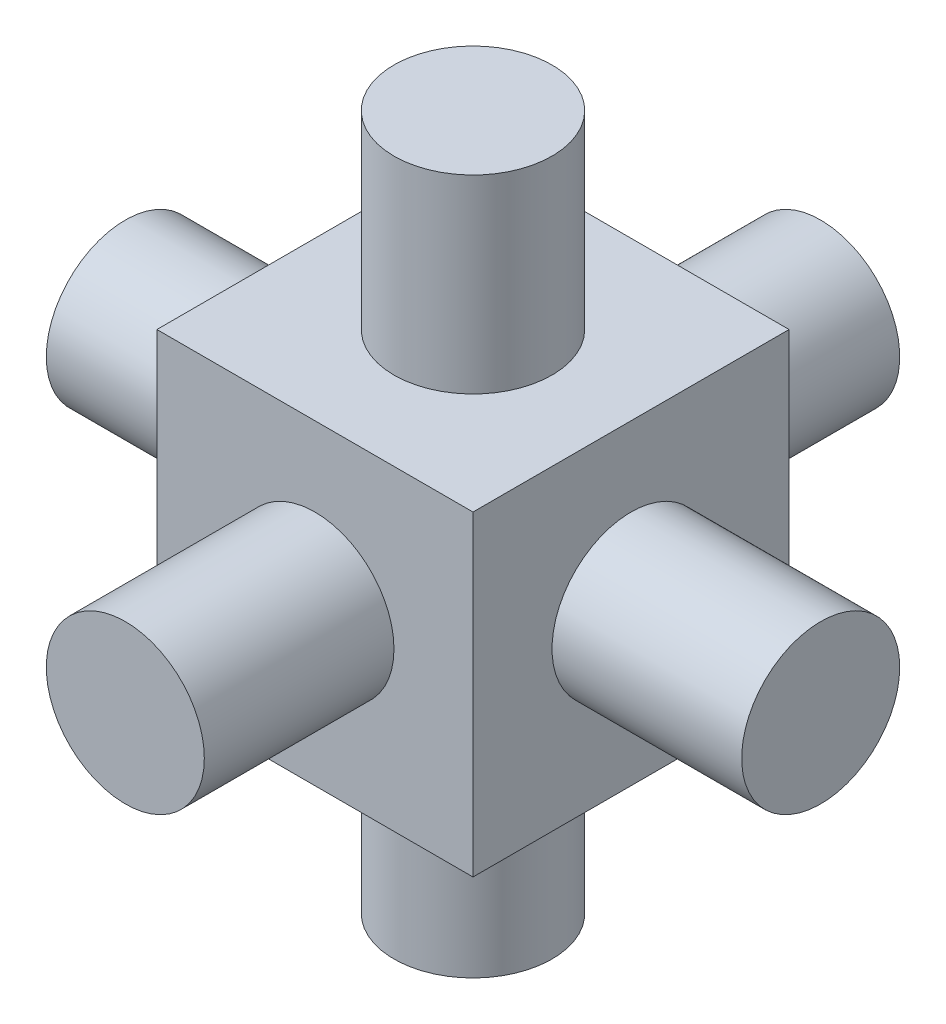
ISO-10303-21;
HEADER;
FILE_DESCRIPTION(('STEP AP214'),'2;1');
FILE_NAME('part.step','',(''),(''),'','','');
FILE_SCHEMA(('AUTOMOTIVE_DESIGN { 1 0 10303 214 1 1 1 1 }'));
ENDSEC;
DATA;
#1=APPLICATION_CONTEXT('core data for automotive mechanical design processes');
#2=APPLICATION_PROTOCOL_DEFINITION('international standard','automotive_design',2000,#1);
#3=PRODUCT_CONTEXT('',#1,'mechanical');
#4=PRODUCT('Part','Part','',(#3));
#5=PRODUCT_RELATED_PRODUCT_CATEGORY('part','',(#4));
#6=PRODUCT_DEFINITION_FORMATION('','',#4);
#7=PRODUCT_DEFINITION_CONTEXT('part definition',#1,'design');
#8=PRODUCT_DEFINITION('design','',#6,#7);
#9=PRODUCT_DEFINITION_SHAPE('','',#8);
#10=(LENGTH_UNIT() NAMED_UNIT(*) SI_UNIT(.MILLI.,.METRE.));
#11=(NAMED_UNIT(*) PLANE_ANGLE_UNIT() SI_UNIT($,.RADIAN.));
#12=(NAMED_UNIT(*) SI_UNIT($,.STERADIAN.) SOLID_ANGLE_UNIT());
#13=UNCERTAINTY_MEASURE_WITH_UNIT(LENGTH_MEASURE(1.E-05),#10,'distance_accuracy_value','');
#14=(GEOMETRIC_REPRESENTATION_CONTEXT(3) GLOBAL_UNCERTAINTY_ASSIGNED_CONTEXT((#13)) GLOBAL_UNIT_ASSIGNED_CONTEXT((#10,
#11,#12)) REPRESENTATION_CONTEXT('',''));
#15=CARTESIAN_POINT('',(0.,0.,0.));
#16=DIRECTION('',(0.,0.,1.));
#17=DIRECTION('',(1.,0.,0.));
#18=AXIS2_PLACEMENT_3D('',#15,#16,#17);
#19=CARTESIAN_POINT('',(10.,-10.,20.));
#20=DIRECTION('',(-1.,0.,0.));
#21=DIRECTION('',(0.,0.,1.));
#22=AXIS2_PLACEMENT_3D('',#19,#20,#21);
#23=PLANE('',#22);
#24=CARTESIAN_POINT('',(10.,0.,10.));
#25=DIRECTION('',(1.,0.,0.));
#26=DIRECTION('',(0.,0.,-1.));
#27=AXIS2_PLACEMENT_3D('',#24,#25,#26);
#28=CIRCLE('',#27,5.);
#29=CARTESIAN_POINT('',(10.,0.,5.));
#30=VERTEX_POINT('',#29);
#31=EDGE_CURVE('E136',#30,#30,#28,.T.);
#32=ORIENTED_EDGE('',*,*,#31,.F.);
#33=EDGE_LOOP('',(#32));
#34=FACE_BOUND('',#33,.T.);
#35=DIRECTION('',(0.,1.,0.));
#36=VECTOR('',#35,1.);
#37=CARTESIAN_POINT('',(10.,-10.,0.));
#38=LINE('',#37,#36);
#39=CARTESIAN_POINT('',(10.,-10.,0.));
#40=VERTEX_POINT('',#39);
#41=CARTESIAN_POINT('',(10.,10.,0.));
#42=VERTEX_POINT('',#41);
#43=EDGE_CURVE('E115',#40,#42,#38,.T.);
#44=ORIENTED_EDGE('',*,*,#43,.T.);
#45=DIRECTION('',(0.,0.,-1.));
#46=VECTOR('',#45,1.);
#47=CARTESIAN_POINT('',(10.,10.,20.));
#48=LINE('',#47,#46);
#49=CARTESIAN_POINT('',(10.,10.,20.));
#50=VERTEX_POINT('',#49);
#51=EDGE_CURVE('E46',#50,#42,#48,.T.);
#52=ORIENTED_EDGE('',*,*,#51,.F.);
#53=DIRECTION('',(0.,1.,0.));
#54=VECTOR('',#53,1.);
#55=CARTESIAN_POINT('',(10.,-10.,20.));
#56=LINE('',#55,#54);
#57=CARTESIAN_POINT('',(10.,-10.,20.));
#58=VERTEX_POINT('',#57);
#59=EDGE_CURVE('E98',#58,#50,#56,.T.);
#60=ORIENTED_EDGE('',*,*,#59,.F.);
#61=DIRECTION('',(0.,0.,-1.));
#62=VECTOR('',#61,1.);
#63=CARTESIAN_POINT('',(10.,-10.,20.));
#64=LINE('',#63,#62);
#65=EDGE_CURVE('E111',#58,#40,#64,.T.);
#66=ORIENTED_EDGE('',*,*,#65,.T.);
#67=EDGE_LOOP('',(#44,#52,#60,#66));
#68=FACE_BOUND('',#67,.T.);
#69=ADVANCED_FACE('F43',(#34,#68),#23,.F.);
#70=CARTESIAN_POINT('',(-10.,10.,20.));
#71=DIRECTION('',(0.,-1.,0.));
#72=DIRECTION('',(0.,0.,-1.));
#73=AXIS2_PLACEMENT_3D('',#70,#71,#72);
#74=PLANE('',#73);
#75=CARTESIAN_POINT('',(0.,10.,10.));
#76=DIRECTION('',(0.,1.,0.));
#77=DIRECTION('',(0.,0.,1.));
#78=AXIS2_PLACEMENT_3D('',#75,#76,#77);
#79=CIRCLE('',#78,5.);
#80=CARTESIAN_POINT('',(0.,10.,15.));
#81=VERTEX_POINT('',#80);
#82=EDGE_CURVE('E140',#81,#81,#79,.T.);
#83=ORIENTED_EDGE('',*,*,#82,.F.);
#84=EDGE_LOOP('',(#83));
#85=FACE_BOUND('',#84,.T.);
#86=DIRECTION('',(-1.,0.,0.));
#87=VECTOR('',#86,1.);
#88=CARTESIAN_POINT('',(-10.,10.,0.));
#89=LINE('',#88,#87);
#90=CARTESIAN_POINT('',(-10.,10.,0.));
#91=VERTEX_POINT('',#90);
#92=EDGE_CURVE('E104',#42,#91,#89,.T.);
#93=ORIENTED_EDGE('',*,*,#92,.T.);
#94=DIRECTION('',(0.,0.,-1.));
#95=VECTOR('',#94,1.);
#96=CARTESIAN_POINT('',(-10.,10.,20.));
#97=LINE('',#96,#95);
#98=CARTESIAN_POINT('',(-10.,10.,20.));
#99=VERTEX_POINT('',#98);
#100=EDGE_CURVE('E102',#99,#91,#97,.T.);
#101=ORIENTED_EDGE('',*,*,#100,.F.);
#102=DIRECTION('',(-1.,0.,0.));
#103=VECTOR('',#102,1.);
#104=CARTESIAN_POINT('',(-10.,10.,20.));
#105=LINE('',#104,#103);
#106=EDGE_CURVE('E93',#50,#99,#105,.T.);
#107=ORIENTED_EDGE('',*,*,#106,.F.);
#108=ORIENTED_EDGE('',*,*,#51,.T.);
#109=EDGE_LOOP('',(#93,#101,#107,#108));
#110=FACE_BOUND('',#109,.T.);
#111=ADVANCED_FACE('F103',(#85,#110),#74,.F.);
#112=CARTESIAN_POINT('',(-10.,-10.,20.));
#113=DIRECTION('',(1.,0.,0.));
#114=DIRECTION('',(0.,0.,-1.));
#115=AXIS2_PLACEMENT_3D('',#112,#113,#114);
#116=PLANE('',#115);
#117=CARTESIAN_POINT('',(-10.,0.,10.));
#118=DIRECTION('',(-1.,0.,0.));
#119=DIRECTION('',(0.,0.,1.));
#120=AXIS2_PLACEMENT_3D('',#117,#118,#119);
#121=CIRCLE('',#120,5.);
#122=CARTESIAN_POINT('',(-10.,0.,15.));
#123=VERTEX_POINT('',#122);
#124=EDGE_CURVE('E148',#123,#123,#121,.T.);
#125=ORIENTED_EDGE('',*,*,#124,.F.);
#126=EDGE_LOOP('',(#125));
#127=FACE_BOUND('',#126,.T.);
#128=DIRECTION('',(0.,-1.,0.));
#129=VECTOR('',#128,1.);
#130=CARTESIAN_POINT('',(-10.,-10.,0.));
#131=LINE('',#130,#129);
#132=CARTESIAN_POINT('',(-10.,-10.,0.));
#133=VERTEX_POINT('',#132);
#134=EDGE_CURVE('E79',#91,#133,#131,.T.);
#135=ORIENTED_EDGE('',*,*,#134,.T.);
#136=DIRECTION('',(0.,0.,-1.));
#137=VECTOR('',#136,1.);
#138=CARTESIAN_POINT('',(-10.,-10.,20.));
#139=LINE('',#138,#137);
#140=CARTESIAN_POINT('',(-10.,-10.,20.));
#141=VERTEX_POINT('',#140);
#142=EDGE_CURVE('E106',#141,#133,#139,.T.);
#143=ORIENTED_EDGE('',*,*,#142,.F.);
#144=DIRECTION('',(0.,-1.,0.));
#145=VECTOR('',#144,1.);
#146=CARTESIAN_POINT('',(-10.,-10.,20.));
#147=LINE('',#146,#145);
#148=EDGE_CURVE('E96',#99,#141,#147,.T.);
#149=ORIENTED_EDGE('',*,*,#148,.F.);
#150=ORIENTED_EDGE('',*,*,#100,.T.);
#151=EDGE_LOOP('',(#135,#143,#149,#150));
#152=FACE_BOUND('',#151,.T.);
#153=ADVANCED_FACE('F107',(#127,#152),#116,.F.);
#154=CARTESIAN_POINT('',(-10.,-10.,20.));
#155=DIRECTION('',(0.,1.,0.));
#156=DIRECTION('',(0.,0.,1.));
#157=AXIS2_PLACEMENT_3D('',#154,#155,#156);
#158=PLANE('',#157);
#159=CARTESIAN_POINT('',(0.,-10.,10.));
#160=DIRECTION('',(0.,-1.,0.));
#161=DIRECTION('',(0.,0.,-1.));
#162=AXIS2_PLACEMENT_3D('',#159,#160,#161);
#163=CIRCLE('',#162,5.);
#164=CARTESIAN_POINT('',(0.,-10.,5.));
#165=VERTEX_POINT('',#164);
#166=EDGE_CURVE('E156',#165,#165,#163,.T.);
#167=ORIENTED_EDGE('',*,*,#166,.F.);
#168=EDGE_LOOP('',(#167));
#169=FACE_BOUND('',#168,.T.);
#170=DIRECTION('',(1.,0.,0.));
#171=VECTOR('',#170,1.);
#172=CARTESIAN_POINT('',(-10.,-10.,0.));
#173=LINE('',#172,#171);
#174=EDGE_CURVE('E85',#133,#40,#173,.T.);
#175=ORIENTED_EDGE('',*,*,#174,.T.);
#176=ORIENTED_EDGE('',*,*,#65,.F.);
#177=DIRECTION('',(1.,0.,0.));
#178=VECTOR('',#177,1.);
#179=CARTESIAN_POINT('',(-10.,-10.,20.));
#180=LINE('',#179,#178);
#181=EDGE_CURVE('E62',#141,#58,#180,.T.);
#182=ORIENTED_EDGE('',*,*,#181,.F.);
#183=ORIENTED_EDGE('',*,*,#142,.T.);
#184=EDGE_LOOP('',(#175,#176,#182,#183));
#185=FACE_BOUND('',#184,.T.);
#186=ADVANCED_FACE('F129',(#169,#185),#158,.F.);
#187=CARTESIAN_POINT('',(0.,0.,20.));
#188=DIRECTION('',(0.,0.,-1.));
#189=DIRECTION('',(-1.,0.,0.));
#190=AXIS2_PLACEMENT_3D('',#187,#188,#189);
#191=PLANE('',#190);
#192=CARTESIAN_POINT('',(0.,0.,20.));
#193=DIRECTION('',(0.,0.,1.));
#194=DIRECTION('',(1.,0.,0.));
#195=AXIS2_PLACEMENT_3D('',#192,#193,#194);
#196=CIRCLE('',#195,5.);
#197=CARTESIAN_POINT('',(5.,0.,20.));
#198=VERTEX_POINT('',#197);
#199=EDGE_CURVE('E11',#198,#198,#196,.T.);
#200=ORIENTED_EDGE('',*,*,#199,.F.);
#201=EDGE_LOOP('',(#200));
#202=FACE_BOUND('',#201,.T.);
#203=ORIENTED_EDGE('',*,*,#59,.T.);
#204=ORIENTED_EDGE('',*,*,#106,.T.);
#205=ORIENTED_EDGE('',*,*,#148,.T.);
#206=ORIENTED_EDGE('',*,*,#181,.T.);
#207=EDGE_LOOP('',(#203,#204,#205,#206));
#208=FACE_BOUND('',#207,.T.);
#209=ADVANCED_FACE('F94',(#202,#208),#191,.F.);
#210=CARTESIAN_POINT('',(0.,0.,0.));
#211=DIRECTION('',(0.,0.,-1.));
#212=DIRECTION('',(-1.,0.,0.));
#213=AXIS2_PLACEMENT_3D('',#210,#211,#212);
#214=PLANE('',#213);
#215=CARTESIAN_POINT('',(0.,0.,0.));
#216=DIRECTION('',(0.,0.,-1.));
#217=DIRECTION('',(-1.,0.,0.));
#218=AXIS2_PLACEMENT_3D('',#215,#216,#217);
#219=CIRCLE('',#218,5.);
#220=CARTESIAN_POINT('',(-5.,0.,0.));
#221=VERTEX_POINT('',#220);
#222=EDGE_CURVE('E53',#221,#221,#219,.T.);
#223=ORIENTED_EDGE('',*,*,#222,.F.);
#224=EDGE_LOOP('',(#223));
#225=FACE_BOUND('',#224,.T.);
#226=ORIENTED_EDGE('',*,*,#43,.F.);
#227=ORIENTED_EDGE('',*,*,#174,.F.);
#228=ORIENTED_EDGE('',*,*,#134,.F.);
#229=ORIENTED_EDGE('',*,*,#92,.F.);
#230=EDGE_LOOP('',(#226,#227,#228,#229));
#231=FACE_BOUND('',#230,.T.);
#232=ADVANCED_FACE('F132',(#225,#231),#214,.T.);
#233=CARTESIAN_POINT('',(22.,0.,10.));
#234=DIRECTION('',(-1.,0.,0.));
#235=DIRECTION('',(0.,0.,1.));
#236=AXIS2_PLACEMENT_3D('',#233,#234,#235);
#237=CYLINDRICAL_SURFACE('',#236,5.);
#238=CARTESIAN_POINT('',(22.,0.,10.));
#239=DIRECTION('',(1.,0.,0.));
#240=DIRECTION('',(0.,0.,-1.));
#241=AXIS2_PLACEMENT_3D('',#238,#239,#240);
#242=CIRCLE('',#241,5.);
#243=CARTESIAN_POINT('',(22.,0.,5.));
#244=VERTEX_POINT('',#243);
#245=EDGE_CURVE('E119',#244,#244,#242,.T.);
#246=ORIENTED_EDGE('',*,*,#245,.F.);
#247=EDGE_LOOP('',(#246));
#248=FACE_BOUND('',#247,.T.);
#249=ORIENTED_EDGE('',*,*,#31,.T.);
#250=EDGE_LOOP('',(#249));
#251=FACE_BOUND('',#250,.T.);
#252=ADVANCED_FACE('F194',(#248,#251),#237,.T.);
#253=CARTESIAN_POINT('',(22.,0.,10.));
#254=DIRECTION('',(1.,0.,0.));
#255=DIRECTION('',(0.,0.,-1.));
#256=AXIS2_PLACEMENT_3D('',#253,#254,#255);
#257=PLANE('',#256);
#258=ORIENTED_EDGE('',*,*,#245,.T.);
#259=EDGE_LOOP('',(#258));
#260=FACE_BOUND('',#259,.T.);
#261=ADVANCED_FACE('F209',(#260),#257,.T.);
#262=CARTESIAN_POINT('',(0.,22.,10.));
#263=DIRECTION('',(0.,-1.,0.));
#264=DIRECTION('',(0.,0.,-1.));
#265=AXIS2_PLACEMENT_3D('',#262,#263,#264);
#266=CYLINDRICAL_SURFACE('',#265,5.);
#267=CARTESIAN_POINT('',(0.,22.,10.));
#268=DIRECTION('',(0.,1.,0.));
#269=DIRECTION('',(0.,0.,1.));
#270=AXIS2_PLACEMENT_3D('',#267,#268,#269);
#271=CIRCLE('',#270,5.);
#272=CARTESIAN_POINT('',(0.,22.,15.));
#273=VERTEX_POINT('',#272);
#274=EDGE_CURVE('E144',#273,#273,#271,.T.);
#275=ORIENTED_EDGE('',*,*,#274,.F.);
#276=EDGE_LOOP('',(#275));
#277=FACE_BOUND('',#276,.T.);
#278=ORIENTED_EDGE('',*,*,#82,.T.);
#279=EDGE_LOOP('',(#278));
#280=FACE_BOUND('',#279,.T.);
#281=ADVANCED_FACE('F214',(#277,#280),#266,.T.);
#282=CARTESIAN_POINT('',(0.,22.,10.));
#283=DIRECTION('',(0.,1.,0.));
#284=DIRECTION('',(0.,0.,1.));
#285=AXIS2_PLACEMENT_3D('',#282,#283,#284);
#286=PLANE('',#285);
#287=ORIENTED_EDGE('',*,*,#274,.T.);
#288=EDGE_LOOP('',(#287));
#289=FACE_BOUND('',#288,.T.);
#290=ADVANCED_FACE('F221',(#289),#286,.T.);
#291=CARTESIAN_POINT('',(-22.,0.,10.));
#292=DIRECTION('',(1.,0.,0.));
#293=DIRECTION('',(0.,0.,-1.));
#294=AXIS2_PLACEMENT_3D('',#291,#292,#293);
#295=CYLINDRICAL_SURFACE('',#294,5.);
#296=CARTESIAN_POINT('',(-22.,0.,10.));
#297=DIRECTION('',(-1.,0.,0.));
#298=DIRECTION('',(0.,0.,1.));
#299=AXIS2_PLACEMENT_3D('',#296,#297,#298);
#300=CIRCLE('',#299,5.);
#301=CARTESIAN_POINT('',(-22.,0.,15.));
#302=VERTEX_POINT('',#301);
#303=EDGE_CURVE('E152',#302,#302,#300,.T.);
#304=ORIENTED_EDGE('',*,*,#303,.F.);
#305=EDGE_LOOP('',(#304));
#306=FACE_BOUND('',#305,.T.);
#307=ORIENTED_EDGE('',*,*,#124,.T.);
#308=EDGE_LOOP('',(#307));
#309=FACE_BOUND('',#308,.T.);
#310=ADVANCED_FACE('F225',(#306,#309),#295,.T.);
#311=CARTESIAN_POINT('',(-22.,0.,10.));
#312=DIRECTION('',(-1.,0.,0.));
#313=DIRECTION('',(0.,0.,1.));
#314=AXIS2_PLACEMENT_3D('',#311,#312,#313);
#315=PLANE('',#314);
#316=ORIENTED_EDGE('',*,*,#303,.T.);
#317=EDGE_LOOP('',(#316));
#318=FACE_BOUND('',#317,.T.);
#319=ADVANCED_FACE('F229',(#318),#315,.T.);
#320=CARTESIAN_POINT('',(0.,-22.,10.));
#321=DIRECTION('',(0.,1.,0.));
#322=DIRECTION('',(0.,0.,1.));
#323=AXIS2_PLACEMENT_3D('',#320,#321,#322);
#324=CYLINDRICAL_SURFACE('',#323,5.);
#325=CARTESIAN_POINT('',(0.,-22.,10.));
#326=DIRECTION('',(0.,-1.,0.));
#327=DIRECTION('',(0.,0.,-1.));
#328=AXIS2_PLACEMENT_3D('',#325,#326,#327);
#329=CIRCLE('',#328,5.);
#330=CARTESIAN_POINT('',(0.,-22.,5.));
#331=VERTEX_POINT('',#330);
#332=EDGE_CURVE('E160',#331,#331,#329,.T.);
#333=ORIENTED_EDGE('',*,*,#332,.F.);
#334=EDGE_LOOP('',(#333));
#335=FACE_BOUND('',#334,.T.);
#336=ORIENTED_EDGE('',*,*,#166,.T.);
#337=EDGE_LOOP('',(#336));
#338=FACE_BOUND('',#337,.T.);
#339=ADVANCED_FACE('F233',(#335,#338),#324,.T.);
#340=CARTESIAN_POINT('',(0.,-22.,10.));
#341=DIRECTION('',(0.,-1.,0.));
#342=DIRECTION('',(0.,0.,-1.));
#343=AXIS2_PLACEMENT_3D('',#340,#341,#342);
#344=PLANE('',#343);
#345=ORIENTED_EDGE('',*,*,#332,.T.);
#346=EDGE_LOOP('',(#345));
#347=FACE_BOUND('',#346,.T.);
#348=ADVANCED_FACE('F237',(#347),#344,.T.);
#349=CARTESIAN_POINT('',(0.,0.,-12.));
#350=DIRECTION('',(0.,0.,1.));
#351=DIRECTION('',(1.,0.,0.));
#352=AXIS2_PLACEMENT_3D('',#349,#350,#351);
#353=CYLINDRICAL_SURFACE('',#352,5.);
#354=CARTESIAN_POINT('',(0.,0.,-12.));
#355=DIRECTION('',(0.,0.,-1.));
#356=DIRECTION('',(-1.,0.,0.));
#357=AXIS2_PLACEMENT_3D('',#354,#355,#356);
#358=CIRCLE('',#357,5.);
#359=CARTESIAN_POINT('',(-5.,0.,-12.));
#360=VERTEX_POINT('',#359);
#361=EDGE_CURVE('E167',#360,#360,#358,.T.);
#362=ORIENTED_EDGE('',*,*,#361,.F.);
#363=EDGE_LOOP('',(#362));
#364=FACE_BOUND('',#363,.T.);
#365=ORIENTED_EDGE('',*,*,#222,.T.);
#366=EDGE_LOOP('',(#365));
#367=FACE_BOUND('',#366,.T.);
#368=ADVANCED_FACE('F241',(#364,#367),#353,.T.);
#369=CARTESIAN_POINT('',(0.,0.,-12.));
#370=DIRECTION('',(0.,0.,-1.));
#371=DIRECTION('',(-1.,0.,0.));
#372=AXIS2_PLACEMENT_3D('',#369,#370,#371);
#373=PLANE('',#372);
#374=ORIENTED_EDGE('',*,*,#361,.T.);
#375=EDGE_LOOP('',(#374));
#376=FACE_BOUND('',#375,.T.);
#377=ADVANCED_FACE('F184',(#376),#373,.T.);
#378=CARTESIAN_POINT('',(0.,0.,32.));
#379=DIRECTION('',(0.,0.,-1.));
#380=DIRECTION('',(-1.,0.,0.));
#381=AXIS2_PLACEMENT_3D('',#378,#379,#380);
#382=CYLINDRICAL_SURFACE('',#381,5.);
#383=CARTESIAN_POINT('',(0.,0.,32.));
#384=DIRECTION('',(0.,0.,1.));
#385=DIRECTION('',(1.,0.,0.));
#386=AXIS2_PLACEMENT_3D('',#383,#384,#385);
#387=CIRCLE('',#386,5.);
#388=CARTESIAN_POINT('',(5.,0.,32.));
#389=VERTEX_POINT('',#388);
#390=EDGE_CURVE('E173',#389,#389,#387,.T.);
#391=ORIENTED_EDGE('',*,*,#390,.F.);
#392=EDGE_LOOP('',(#391));
#393=FACE_BOUND('',#392,.T.);
#394=ORIENTED_EDGE('',*,*,#199,.T.);
#395=EDGE_LOOP('',(#394));
#396=FACE_BOUND('',#395,.T.);
#397=ADVANCED_FACE('F181',(#393,#396),#382,.T.);
#398=CARTESIAN_POINT('',(0.,0.,32.));
#399=DIRECTION('',(0.,0.,1.));
#400=DIRECTION('',(1.,0.,0.));
#401=AXIS2_PLACEMENT_3D('',#398,#399,#400);
#402=PLANE('',#401);
#403=ORIENTED_EDGE('',*,*,#390,.T.);
#404=EDGE_LOOP('',(#403));
#405=FACE_BOUND('',#404,.T.);
#406=ADVANCED_FACE('F179',(#405),#402,.T.);
#407=CLOSED_SHELL('',(#69,#111,#153,#186,#209,#232,#252,#261,#281,#290,#310,#319,#339,#348,#368,
#377,#397,#406));
#408=MANIFOLD_SOLID_BREP('B2',#407);
#409=ADVANCED_BREP_SHAPE_REPRESENTATION('',(#18,#408),#14);
#410=SHAPE_DEFINITION_REPRESENTATION(#9,#409);
ENDSEC;
END-ISO-10303-21;
